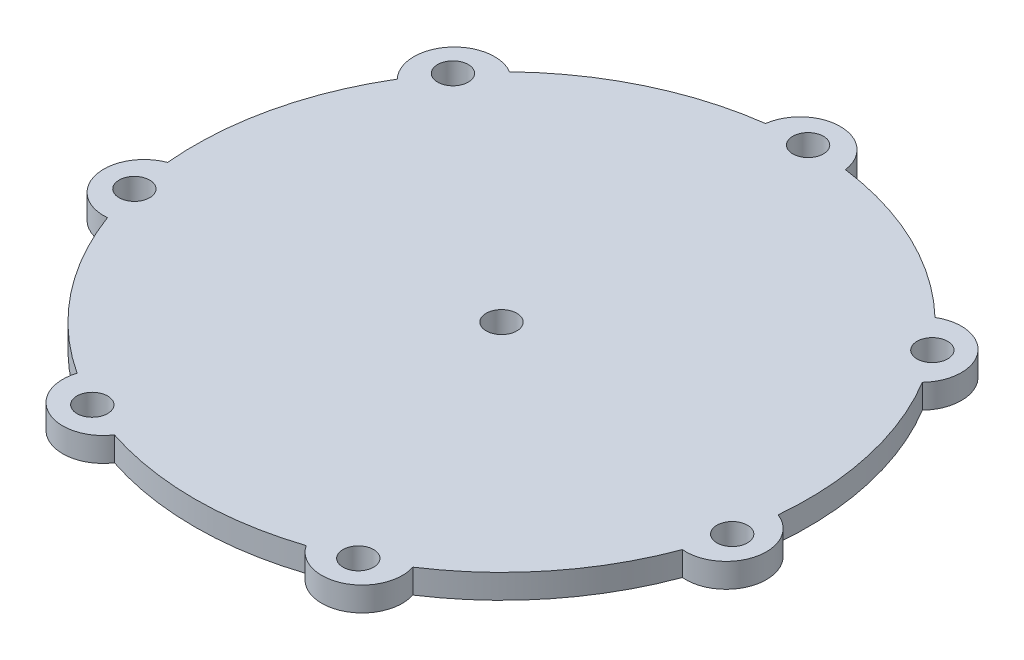
ISO-10303-21;
HEADER;
FILE_DESCRIPTION(('STEP AP214'),'2;1');
FILE_NAME('part.step','',(''),(''),'','','');
FILE_SCHEMA(('AUTOMOTIVE_DESIGN { 1 0 10303 214 1 1 1 1 }'));
ENDSEC;
DATA;
#1=APPLICATION_CONTEXT('core data for automotive mechanical design processes');
#2=APPLICATION_PROTOCOL_DEFINITION('international standard','automotive_design',2000,#1);
#3=PRODUCT_CONTEXT('',#1,'mechanical');
#4=PRODUCT('Part','Part','',(#3));
#5=PRODUCT_RELATED_PRODUCT_CATEGORY('part','',(#4));
#6=PRODUCT_DEFINITION_FORMATION('','',#4);
#7=PRODUCT_DEFINITION_CONTEXT('part definition',#1,'design');
#8=PRODUCT_DEFINITION('design','',#6,#7);
#9=PRODUCT_DEFINITION_SHAPE('','',#8);
#10=(LENGTH_UNIT() NAMED_UNIT(*) SI_UNIT(.MILLI.,.METRE.));
#11=(NAMED_UNIT(*) PLANE_ANGLE_UNIT() SI_UNIT($,.RADIAN.));
#12=(NAMED_UNIT(*) SI_UNIT($,.STERADIAN.) SOLID_ANGLE_UNIT());
#13=UNCERTAINTY_MEASURE_WITH_UNIT(LENGTH_MEASURE(1.E-05),#10,'distance_accuracy_value','');
#14=(GEOMETRIC_REPRESENTATION_CONTEXT(3) GLOBAL_UNCERTAINTY_ASSIGNED_CONTEXT((#13)) GLOBAL_UNIT_ASSIGNED_CONTEXT((#10,
#11,#12)) REPRESENTATION_CONTEXT('',''));
#15=CARTESIAN_POINT('',(0.,0.,0.));
#16=DIRECTION('',(0.,0.,1.));
#17=DIRECTION('',(1.,0.,0.));
#18=AXIS2_PLACEMENT_3D('',#15,#16,#17);
#19=CARTESIAN_POINT('',(0.,7.,0.));
#20=DIRECTION('',(0.,-1.,0.));
#21=DIRECTION('',(0.,0.,-1.));
#22=AXIS2_PLACEMENT_3D('',#19,#20,#21);
#23=CYLINDRICAL_SURFACE('',#22,38.);
#24=CARTESIAN_POINT('',(0.,3.,0.));
#25=DIRECTION('',(0.,1.,0.));
#26=DIRECTION('',(0.,0.,1.));
#27=AXIS2_PLACEMENT_3D('',#24,#25,#26);
#28=CIRCLE('',#27,38.);
#29=CARTESIAN_POINT('',(-4.95413588643874,3.,-37.6756756756757));
#30=VERTEX_POINT('',#29);
#31=CARTESIAN_POINT('',(-26.3671761642809,3.,-27.3636989663637));
#32=VERTEX_POINT('',#31);
#33=EDGE_CURVE('E1106',#30,#32,#28,.T.);
#34=ORIENTED_EDGE('',*,*,#33,.F.);
#35=DIRECTION('',(0.,-1.,0.));
#36=VECTOR('',#35,1.);
#37=CARTESIAN_POINT('',(-4.95413588643874,41.8108108108108,-37.6756756756757));
#38=LINE('',#37,#36);
#39=CARTESIAN_POINT('',(-4.95413588643874,0.,-37.6756756756757));
#40=VERTEX_POINT('',#39);
#41=EDGE_CURVE('E1012',#30,#40,#38,.T.);
#42=ORIENTED_EDGE('',*,*,#41,.T.);
#43=CARTESIAN_POINT('',(0.,0.,0.));
#44=DIRECTION('',(0.,1.,0.));
#45=DIRECTION('',(0.,0.,1.));
#46=AXIS2_PLACEMENT_3D('',#43,#44,#45);
#47=CIRCLE('',#46,38.);
#48=CARTESIAN_POINT('',(-26.3671761642809,0.,-27.3636989663637));
#49=VERTEX_POINT('',#48);
#50=EDGE_CURVE('E13',#40,#49,#47,.T.);
#51=ORIENTED_EDGE('',*,*,#50,.T.);
#52=DIRECTION('',(0.,-1.,0.));
#53=VECTOR('',#52,1.);
#54=CARTESIAN_POINT('',(-26.3671761642809,42.3401581040992,-27.3636989663637));
#55=LINE('',#54,#53);
#56=EDGE_CURVE('E1123',#32,#49,#55,.T.);
#57=ORIENTED_EDGE('',*,*,#56,.F.);
#58=EDGE_LOOP('',(#34,#42,#51,#57));
#59=FACE_BOUND('',#58,.T.);
#60=ADVANCED_FACE('F997',(#59),#23,.T.);
#61=CARTESIAN_POINT('',(0.,3.,0.));
#62=DIRECTION('',(0.,1.,0.));
#63=DIRECTION('',(0.,0.,1.));
#64=AXIS2_PLACEMENT_3D('',#61,#62,#63);
#65=CIRCLE('',#64,38.);
#66=CARTESIAN_POINT('',(-32.5448825687149,3.,-19.6171001574789));
#67=VERTEX_POINT('',#66);
#68=CARTESIAN_POINT('',(-37.8334667709229,3.,3.55370118235541));
#69=VERTEX_POINT('',#68);
#70=EDGE_CURVE('E1104',#67,#69,#65,.T.);
#71=ORIENTED_EDGE('',*,*,#70,.F.);
#72=DIRECTION('',(0.,-1.,0.));
#73=VECTOR('',#72,1.);
#74=CARTESIAN_POINT('',(-32.5448825687149,42.3401581040992,-19.6171001574789));
#75=LINE('',#74,#73);
#76=CARTESIAN_POINT('',(-32.5448825687149,0.,-19.6171001574789));
#77=VERTEX_POINT('',#76);
#78=EDGE_CURVE('E1115',#67,#77,#75,.T.);
#79=ORIENTED_EDGE('',*,*,#78,.T.);
#80=CARTESIAN_POINT('',(-37.8334667709229,0.,3.55370118235541));
#81=VERTEX_POINT('',#80);
#82=EDGE_CURVE('E1005',#77,#81,#47,.T.);
#83=ORIENTED_EDGE('',*,*,#82,.T.);
#84=DIRECTION('',(0.,-1.,0.));
#85=VECTOR('',#84,1.);
#86=CARTESIAN_POINT('',(-37.8334667709229,42.1052968000622,3.55370118235541));
#87=LINE('',#86,#85);
#88=EDGE_CURVE('E1117',#69,#81,#87,.T.);
#89=ORIENTED_EDGE('',*,*,#88,.F.);
#90=EDGE_LOOP('',(#71,#79,#83,#89));
#91=FACE_BOUND('',#90,.T.);
#92=ADVANCED_FACE('F1113',(#91),#23,.T.);
#93=CARTESIAN_POINT('',(0.,3.,0.));
#94=DIRECTION('',(0.,1.,0.));
#95=DIRECTION('',(0.,0.,1.));
#96=AXIS2_PLACEMENT_3D('',#93,#94,#95);
#97=CIRCLE('',#96,38.);
#98=CARTESIAN_POINT('',(-35.6286688821293,3.,13.213551895217));
#99=VERTEX_POINT('',#98);
#100=CARTESIAN_POINT('',(-20.8103852369823,3.,31.7950918584675));
#101=VERTEX_POINT('',#100);
#102=EDGE_CURVE('E1237',#99,#101,#97,.T.);
#103=ORIENTED_EDGE('',*,*,#102,.F.);
#104=DIRECTION('',(0.,-1.,0.));
#105=VECTOR('',#104,1.);
#106=CARTESIAN_POINT('',(-35.6286688821293,42.1052968000622,13.213551895217));
#107=LINE('',#106,#105);
#108=CARTESIAN_POINT('',(-35.6286688821293,0.,13.213551895217));
#109=VERTEX_POINT('',#108);
#110=EDGE_CURVE('E1138',#99,#109,#107,.T.);
#111=ORIENTED_EDGE('',*,*,#110,.T.);
#112=CARTESIAN_POINT('',(-20.8103852369823,0.,31.7950918584675));
#113=VERTEX_POINT('',#112);
#114=EDGE_CURVE('E1217',#109,#113,#47,.T.);
#115=ORIENTED_EDGE('',*,*,#114,.T.);
#116=DIRECTION('',(0.,-1.,0.));
#117=VECTOR('',#116,1.);
#118=CARTESIAN_POINT('',(-20.8103852369823,42.2639668536134,31.7950918584675));
#119=LINE('',#118,#117);
#120=EDGE_CURVE('E1134',#101,#113,#119,.T.);
#121=ORIENTED_EDGE('',*,*,#120,.F.);
#122=EDGE_LOOP('',(#103,#111,#115,#121));
#123=FACE_BOUND('',#122,.T.);
#124=ADVANCED_FACE('F1301',(#123),#23,.T.);
#125=CARTESIAN_POINT('',(0.,3.,0.));
#126=DIRECTION('',(0.,1.,0.));
#127=DIRECTION('',(0.,0.,1.));
#128=AXIS2_PLACEMENT_3D('',#125,#126,#127);
#129=CIRCLE('',#128,38.);
#130=CARTESIAN_POINT('',(-11.8833408349034,3.,36.0941298634767));
#131=VERTEX_POINT('',#130);
#132=CARTESIAN_POINT('',(11.8833408349029,3.,36.0941298634768));
#133=VERTEX_POINT('',#132);
#134=EDGE_CURVE('E1248',#131,#133,#129,.T.);
#135=ORIENTED_EDGE('',*,*,#134,.F.);
#136=DIRECTION('',(0.,-1.,0.));
#137=VECTOR('',#136,1.);
#138=CARTESIAN_POINT('',(-11.8833408349034,42.2639668536134,36.0941298634767));
#139=LINE('',#138,#137);
#140=CARTESIAN_POINT('',(-11.8833408349034,0.,36.0941298634767));
#141=VERTEX_POINT('',#140);
#142=EDGE_CURVE('E1148',#131,#141,#139,.T.);
#143=ORIENTED_EDGE('',*,*,#142,.T.);
#144=CARTESIAN_POINT('',(11.8833408349029,0.,36.0941298634768));
#145=VERTEX_POINT('',#144);
#146=EDGE_CURVE('E1212',#141,#145,#47,.T.);
#147=ORIENTED_EDGE('',*,*,#146,.T.);
#148=DIRECTION('',(0.,-1.,0.));
#149=VECTOR('',#148,1.);
#150=CARTESIAN_POINT('',(11.8833408349029,42.2639668536134,36.0941298634768));
#151=LINE('',#150,#149);
#152=EDGE_CURVE('E1144',#133,#145,#151,.T.);
#153=ORIENTED_EDGE('',*,*,#152,.F.);
#154=EDGE_LOOP('',(#135,#143,#147,#153));
#155=FACE_BOUND('',#154,.T.);
#156=ADVANCED_FACE('F1314',(#155),#23,.T.);
#157=CARTESIAN_POINT('',(0.,3.,0.));
#158=DIRECTION('',(0.,1.,0.));
#159=DIRECTION('',(0.,0.,1.));
#160=AXIS2_PLACEMENT_3D('',#157,#158,#159);
#161=CIRCLE('',#160,38.);
#162=CARTESIAN_POINT('',(20.8103852369819,3.,31.7950918584678));
#163=VERTEX_POINT('',#162);
#164=CARTESIAN_POINT('',(35.6286688821291,3.,13.2135518952175));
#165=VERTEX_POINT('',#164);
#166=EDGE_CURVE('E1243',#163,#165,#161,.T.);
#167=ORIENTED_EDGE('',*,*,#166,.F.);
#168=DIRECTION('',(0.,-1.,0.));
#169=VECTOR('',#168,1.);
#170=CARTESIAN_POINT('',(20.8103852369819,42.2639668536134,31.7950918584678));
#171=LINE('',#170,#169);
#172=CARTESIAN_POINT('',(20.8103852369819,0.,31.7950918584678));
#173=VERTEX_POINT('',#172);
#174=EDGE_CURVE('E1158',#163,#173,#171,.T.);
#175=ORIENTED_EDGE('',*,*,#174,.T.);
#176=CARTESIAN_POINT('',(35.6286688821291,0.,13.2135518952175));
#177=VERTEX_POINT('',#176);
#178=EDGE_CURVE('E1207',#173,#177,#47,.T.);
#179=ORIENTED_EDGE('',*,*,#178,.T.);
#180=DIRECTION('',(0.,-1.,0.));
#181=VECTOR('',#180,1.);
#182=CARTESIAN_POINT('',(35.6286688821291,42.1052968000622,13.2135518952175));
#183=LINE('',#182,#181);
#184=EDGE_CURVE('E1154',#165,#177,#183,.T.);
#185=ORIENTED_EDGE('',*,*,#184,.F.);
#186=EDGE_LOOP('',(#167,#175,#179,#185));
#187=FACE_BOUND('',#186,.T.);
#188=ADVANCED_FACE('F1310',(#187),#23,.T.);
#189=CARTESIAN_POINT('',(0.,3.,0.));
#190=DIRECTION('',(0.,1.,0.));
#191=DIRECTION('',(0.,0.,1.));
#192=AXIS2_PLACEMENT_3D('',#189,#190,#191);
#193=CIRCLE('',#192,38.);
#194=CARTESIAN_POINT('',(37.8334667709228,3.,3.55370118235592));
#195=VERTEX_POINT('',#194);
#196=CARTESIAN_POINT('',(32.5448825687152,3.,-19.6171001574784));
#197=VERTEX_POINT('',#196);
#198=EDGE_CURVE('E1232',#195,#197,#193,.T.);
#199=ORIENTED_EDGE('',*,*,#198,.F.);
#200=DIRECTION('',(0.,-1.,0.));
#201=VECTOR('',#200,1.);
#202=CARTESIAN_POINT('',(37.8334667709228,42.1052968000622,3.55370118235592));
#203=LINE('',#202,#201);
#204=CARTESIAN_POINT('',(37.8334667709228,0.,3.55370118235592));
#205=VERTEX_POINT('',#204);
#206=EDGE_CURVE('E1168',#195,#205,#203,.T.);
#207=ORIENTED_EDGE('',*,*,#206,.T.);
#208=CARTESIAN_POINT('',(32.5448825687152,0.,-19.6171001574784));
#209=VERTEX_POINT('',#208);
#210=EDGE_CURVE('E1205',#205,#209,#47,.T.);
#211=ORIENTED_EDGE('',*,*,#210,.T.);
#212=DIRECTION('',(0.,-1.,0.));
#213=VECTOR('',#212,1.);
#214=CARTESIAN_POINT('',(32.5448825687152,42.3401581040992,-19.6171001574784));
#215=LINE('',#214,#213);
#216=EDGE_CURVE('E1164',#197,#209,#215,.T.);
#217=ORIENTED_EDGE('',*,*,#216,.F.);
#218=EDGE_LOOP('',(#199,#207,#211,#217));
#219=FACE_BOUND('',#218,.T.);
#220=ADVANCED_FACE('F1303',(#219),#23,.T.);
#221=CARTESIAN_POINT('',(0.,3.,0.));
#222=DIRECTION('',(0.,1.,0.));
#223=DIRECTION('',(0.,0.,1.));
#224=AXIS2_PLACEMENT_3D('',#221,#222,#223);
#225=CIRCLE('',#224,38.);
#226=CARTESIAN_POINT('',(26.3671761642813,3.,-27.3636989663634));
#227=VERTEX_POINT('',#226);
#228=CARTESIAN_POINT('',(4.95413588643874,3.,-37.6756756756757));
#229=VERTEX_POINT('',#228);
#230=EDGE_CURVE('E1194',#227,#229,#225,.T.);
#231=ORIENTED_EDGE('',*,*,#230,.F.);
#232=DIRECTION('',(0.,-1.,0.));
#233=VECTOR('',#232,1.);
#234=CARTESIAN_POINT('',(26.3671761642813,42.3401581040992,-27.3636989663634));
#235=LINE('',#234,#233);
#236=CARTESIAN_POINT('',(26.3671761642813,0.,-27.3636989663634));
#237=VERTEX_POINT('',#236);
#238=EDGE_CURVE('E1177',#227,#237,#235,.T.);
#239=ORIENTED_EDGE('',*,*,#238,.T.);
#240=CARTESIAN_POINT('',(4.95413588643874,0.,-37.6756756756757));
#241=VERTEX_POINT('',#240);
#242=EDGE_CURVE('E1006',#237,#241,#47,.T.);
#243=ORIENTED_EDGE('',*,*,#242,.T.);
#244=DIRECTION('',(0.,-1.,0.));
#245=VECTOR('',#244,1.);
#246=CARTESIAN_POINT('',(4.95413588643874,41.8108108108108,-37.6756756756757));
#247=LINE('',#246,#245);
#248=EDGE_CURVE('E1019',#229,#241,#247,.T.);
#249=ORIENTED_EDGE('',*,*,#248,.F.);
#250=EDGE_LOOP('',(#231,#239,#243,#249));
#251=FACE_BOUND('',#250,.T.);
#252=ADVANCED_FACE('F1203',(#251),#23,.T.);
#253=CARTESIAN_POINT('',(0.,41.8108108108108,-37.));
#254=DIRECTION('',(0.,-1.,0.));
#255=DIRECTION('',(0.,0.,-1.));
#256=AXIS2_PLACEMENT_3D('',#253,#254,#255);
#257=CYLINDRICAL_SURFACE('',#256,5.);
#258=CARTESIAN_POINT('',(0.,3.,-37.));
#259=DIRECTION('',(0.,1.,0.));
#260=DIRECTION('',(0.,0.,1.));
#261=AXIS2_PLACEMENT_3D('',#258,#259,#260);
#262=CIRCLE('',#261,5.);
#263=EDGE_CURVE('E1192',#30,#229,#262,.F.);
#264=ORIENTED_EDGE('',*,*,#263,.T.);
#265=ORIENTED_EDGE('',*,*,#248,.T.);
#266=CARTESIAN_POINT('',(0.,0.,-37.));
#267=DIRECTION('',(0.,1.,0.));
#268=DIRECTION('',(0.,0.,1.));
#269=AXIS2_PLACEMENT_3D('',#266,#267,#268);
#270=CIRCLE('',#269,5.);
#271=EDGE_CURVE('E1183',#40,#241,#270,.F.);
#272=ORIENTED_EDGE('',*,*,#271,.F.);
#273=ORIENTED_EDGE('',*,*,#41,.F.);
#274=EDGE_LOOP('',(#264,#265,#272,#273));
#275=FACE_BOUND('',#274,.T.);
#276=ADVANCED_FACE('F1191',(#275),#257,.T.);
#277=CARTESIAN_POINT('',(0.,41.8108108108108,-38.));
#278=DIRECTION('',(0.,-1.,0.));
#279=DIRECTION('',(0.,0.,-1.));
#280=AXIS2_PLACEMENT_3D('',#277,#278,#279);
#281=CYLINDRICAL_SURFACE('',#280,1.9);
#282=CARTESIAN_POINT('',(0.,0.,-38.));
#283=DIRECTION('',(0.,1.,0.));
#284=DIRECTION('',(0.,0.,1.));
#285=AXIS2_PLACEMENT_3D('',#282,#283,#284);
#286=CIRCLE('',#285,1.9);
#287=CARTESIAN_POINT('',(0.,0.,-36.1));
#288=VERTEX_POINT('',#287);
#289=EDGE_CURVE('E1180',#288,#288,#286,.T.);
#290=ORIENTED_EDGE('',*,*,#289,.F.);
#291=EDGE_LOOP('',(#290));
#292=FACE_BOUND('',#291,.T.);
#293=CARTESIAN_POINT('',(0.,3.,-38.));
#294=DIRECTION('',(0.,1.,0.));
#295=DIRECTION('',(0.,0.,1.));
#296=AXIS2_PLACEMENT_3D('',#293,#294,#295);
#297=CIRCLE('',#296,1.9);
#298=CARTESIAN_POINT('',(0.,3.,-36.1));
#299=VERTEX_POINT('',#298);
#300=EDGE_CURVE('E1265',#299,#299,#297,.T.);
#301=ORIENTED_EDGE('',*,*,#300,.T.);
#302=EDGE_LOOP('',(#301));
#303=FACE_BOUND('',#302,.T.);
#304=ADVANCED_FACE('F1308',(#292,#303),#281,.F.);
#305=CARTESIAN_POINT('',(28.9277648513172,42.3401581040992,-23.0691226687731));
#306=DIRECTION('',(0.,-1.,0.));
#307=DIRECTION('',(0.,0.,-1.));
#308=AXIS2_PLACEMENT_3D('',#305,#306,#307);
#309=CYLINDRICAL_SURFACE('',#308,5.);
#310=CARTESIAN_POINT('',(28.9277648513172,3.,-23.0691226687731));
#311=DIRECTION('',(0.,1.,0.));
#312=DIRECTION('',(0.,0.,1.));
#313=AXIS2_PLACEMENT_3D('',#310,#311,#312);
#314=CIRCLE('',#313,5.);
#315=EDGE_CURVE('E1198',#227,#197,#314,.F.);
#316=ORIENTED_EDGE('',*,*,#315,.T.);
#317=ORIENTED_EDGE('',*,*,#216,.T.);
#318=CARTESIAN_POINT('',(28.9277648513172,0.,-23.0691226687731));
#319=DIRECTION('',(0.,1.,0.));
#320=DIRECTION('',(-0.781831482468031,0.,0.623489801858732));
#321=AXIS2_PLACEMENT_3D('',#318,#319,#320);
#322=CIRCLE('',#321,5.);
#323=EDGE_CURVE('E1174',#237,#209,#322,.F.);
#324=ORIENTED_EDGE('',*,*,#323,.F.);
#325=ORIENTED_EDGE('',*,*,#238,.F.);
#326=EDGE_LOOP('',(#316,#317,#324,#325));
#327=FACE_BOUND('',#326,.T.);
#328=ADVANCED_FACE('F1321',(#327),#309,.T.);
#329=CARTESIAN_POINT('',(29.7095963337852,42.3401581040992,-23.6926124706318));
#330=DIRECTION('',(0.,-1.,0.));
#331=DIRECTION('',(0.,0.,-1.));
#332=AXIS2_PLACEMENT_3D('',#329,#330,#331);
#333=CYLINDRICAL_SURFACE('',#332,1.9);
#334=CARTESIAN_POINT('',(29.7095963337852,0.,-23.6926124706318));
#335=DIRECTION('',(0.,1.,0.));
#336=DIRECTION('',(-0.781831482468031,0.,0.623489801858732));
#337=AXIS2_PLACEMENT_3D('',#334,#335,#336);
#338=CIRCLE('',#337,1.9);
#339=CARTESIAN_POINT('',(28.2241165170959,0.,-22.5079818471002));
#340=VERTEX_POINT('',#339);
#341=EDGE_CURVE('E1171',#340,#340,#338,.T.);
#342=ORIENTED_EDGE('',*,*,#341,.F.);
#343=EDGE_LOOP('',(#342));
#344=FACE_BOUND('',#343,.T.);
#345=CARTESIAN_POINT('',(29.7095963337852,3.,-23.6926124706318));
#346=DIRECTION('',(0.,1.,0.));
#347=DIRECTION('',(0.,0.,1.));
#348=AXIS2_PLACEMENT_3D('',#345,#346,#347);
#349=CIRCLE('',#348,1.9);
#350=CARTESIAN_POINT('',(29.7095963337852,3.,-21.7926124706318));
#351=VERTEX_POINT('',#350);
#352=EDGE_CURVE('E1262',#351,#351,#349,.T.);
#353=ORIENTED_EDGE('',*,*,#352,.T.);
#354=EDGE_LOOP('',(#353));
#355=FACE_BOUND('',#354,.T.);
#356=ADVANCED_FACE('F1323',(#344,#355),#333,.F.);
#357=CARTESIAN_POINT('',(36.0723327507274,42.1052968000622,8.23327455638378));
#358=DIRECTION('',(0.,-1.,0.));
#359=DIRECTION('',(0.,0.,-1.));
#360=AXIS2_PLACEMENT_3D('',#357,#358,#359);
#361=CYLINDRICAL_SURFACE('',#360,5.);
#362=CARTESIAN_POINT('',(36.0723327507274,3.,8.23327455638378));
#363=DIRECTION('',(0.,1.,0.));
#364=DIRECTION('',(0.,0.,1.));
#365=AXIS2_PLACEMENT_3D('',#362,#363,#364);
#366=CIRCLE('',#365,5.);
#367=EDGE_CURVE('E1239',#195,#165,#366,.F.);
#368=ORIENTED_EDGE('',*,*,#367,.T.);
#369=ORIENTED_EDGE('',*,*,#184,.T.);
#370=CARTESIAN_POINT('',(36.0723327507274,0.,8.23327455638378));
#371=DIRECTION('',(0.,1.,0.));
#372=DIRECTION('',(-0.974927912181823,0.,-0.222520933956318));
#373=AXIS2_PLACEMENT_3D('',#370,#371,#372);
#374=CIRCLE('',#373,5.);
#375=EDGE_CURVE('E1165',#205,#177,#374,.F.);
#376=ORIENTED_EDGE('',*,*,#375,.F.);
#377=ORIENTED_EDGE('',*,*,#206,.F.);
#378=EDGE_LOOP('',(#368,#369,#376,#377));
#379=FACE_BOUND('',#378,.T.);
#380=ADVANCED_FACE('F1319',(#379),#361,.T.);
#381=CARTESIAN_POINT('',(37.0472606629093,42.1052968000622,8.45579549034009));
#382=DIRECTION('',(0.,-1.,0.));
#383=DIRECTION('',(0.,0.,-1.));
#384=AXIS2_PLACEMENT_3D('',#381,#382,#383);
#385=CYLINDRICAL_SURFACE('',#384,1.9);
#386=CARTESIAN_POINT('',(37.0472606629093,0.,8.45579549034009));
#387=DIRECTION('',(0.,1.,0.));
#388=DIRECTION('',(-0.974927912181823,0.,-0.222520933956318));
#389=AXIS2_PLACEMENT_3D('',#386,#387,#388);
#390=CIRCLE('',#389,1.9);
#391=CARTESIAN_POINT('',(35.1948976297638,0.,8.03300571582309));
#392=VERTEX_POINT('',#391);
#393=EDGE_CURVE('E1161',#392,#392,#390,.T.);
#394=ORIENTED_EDGE('',*,*,#393,.F.);
#395=EDGE_LOOP('',(#394));
#396=FACE_BOUND('',#395,.T.);
#397=CARTESIAN_POINT('',(37.0472606629093,3.,8.45579549034009));
#398=DIRECTION('',(0.,1.,0.));
#399=DIRECTION('',(0.,0.,1.));
#400=AXIS2_PLACEMENT_3D('',#397,#398,#399);
#401=CIRCLE('',#400,1.9);
#402=CARTESIAN_POINT('',(37.0472606629093,3.,10.3557954903401));
#403=VERTEX_POINT('',#402);
#404=EDGE_CURVE('E1259',#403,#403,#401,.T.);
#405=ORIENTED_EDGE('',*,*,#404,.T.);
#406=EDGE_LOOP('',(#405));
#407=FACE_BOUND('',#406,.T.);
#408=ADVANCED_FACE('F1336',(#396,#407),#385,.F.);
#409=CARTESIAN_POINT('',(16.0536983473495,42.2639668536134,33.3358481123896));
#410=DIRECTION('',(0.,-1.,0.));
#411=DIRECTION('',(0.,0.,-1.));
#412=AXIS2_PLACEMENT_3D('',#409,#410,#411);
#413=CYLINDRICAL_SURFACE('',#412,5.);
#414=CARTESIAN_POINT('',(16.0536983473495,3.,33.3358481123896));
#415=DIRECTION('',(0.,1.,0.));
#416=DIRECTION('',(0.,0.,1.));
#417=AXIS2_PLACEMENT_3D('',#414,#415,#416);
#418=CIRCLE('',#417,5.);
#419=EDGE_CURVE('E1242',#163,#133,#418,.F.);
#420=ORIENTED_EDGE('',*,*,#419,.T.);
#421=ORIENTED_EDGE('',*,*,#152,.T.);
#422=CARTESIAN_POINT('',(16.0536983473495,0.,33.3358481123896));
#423=DIRECTION('',(0.,1.,0.));
#424=DIRECTION('',(-0.433883739117553,0.,-0.900968867902422));
#425=AXIS2_PLACEMENT_3D('',#422,#423,#424);
#426=CIRCLE('',#425,5.);
#427=EDGE_CURVE('E1155',#173,#145,#426,.F.);
#428=ORIENTED_EDGE('',*,*,#427,.F.);
#429=ORIENTED_EDGE('',*,*,#174,.F.);
#430=EDGE_LOOP('',(#420,#421,#428,#429));
#431=FACE_BOUND('',#430,.T.);
#432=ADVANCED_FACE('F1339',(#431),#413,.T.);
#433=CARTESIAN_POINT('',(16.487582086467,42.2639668536134,34.236816980292));
#434=DIRECTION('',(0.,-1.,0.));
#435=DIRECTION('',(0.,0.,-1.));
#436=AXIS2_PLACEMENT_3D('',#433,#434,#435);
#437=CYLINDRICAL_SURFACE('',#436,1.9);
#438=CARTESIAN_POINT('',(16.487582086467,0.,34.236816980292));
#439=DIRECTION('',(0.,1.,0.));
#440=DIRECTION('',(-0.433883739117553,0.,-0.900968867902422));
#441=AXIS2_PLACEMENT_3D('',#438,#439,#440);
#442=CIRCLE('',#441,1.9);
#443=CARTESIAN_POINT('',(15.6632029821437,0.,32.5249761312774));
#444=VERTEX_POINT('',#443);
#445=EDGE_CURVE('E1151',#444,#444,#442,.T.);
#446=ORIENTED_EDGE('',*,*,#445,.F.);
#447=EDGE_LOOP('',(#446));
#448=FACE_BOUND('',#447,.T.);
#449=CARTESIAN_POINT('',(16.487582086467,3.,34.236816980292));
#450=DIRECTION('',(0.,1.,0.));
#451=DIRECTION('',(0.,0.,1.));
#452=AXIS2_PLACEMENT_3D('',#449,#450,#451);
#453=CIRCLE('',#452,1.9);
#454=CARTESIAN_POINT('',(16.487582086467,3.,36.136816980292));
#455=VERTEX_POINT('',#454);
#456=EDGE_CURVE('E1256',#455,#455,#453,.T.);
#457=ORIENTED_EDGE('',*,*,#456,.T.);
#458=EDGE_LOOP('',(#457));
#459=FACE_BOUND('',#458,.T.);
#460=ADVANCED_FACE('F1343',(#448,#459),#437,.F.);
#461=CARTESIAN_POINT('',(-16.0536983473499,42.2639668536134,33.3358481123894));
#462=DIRECTION('',(0.,-1.,0.));
#463=DIRECTION('',(0.,0.,-1.));
#464=AXIS2_PLACEMENT_3D('',#461,#462,#463);
#465=CYLINDRICAL_SURFACE('',#464,5.);
#466=CARTESIAN_POINT('',(-16.0536983473499,3.,33.3358481123894));
#467=DIRECTION('',(0.,1.,0.));
#468=DIRECTION('',(0.,0.,1.));
#469=AXIS2_PLACEMENT_3D('',#466,#467,#468);
#470=CIRCLE('',#469,5.);
#471=EDGE_CURVE('E1240',#131,#101,#470,.F.);
#472=ORIENTED_EDGE('',*,*,#471,.T.);
#473=ORIENTED_EDGE('',*,*,#120,.T.);
#474=CARTESIAN_POINT('',(-16.0536983473499,0.,33.3358481123894));
#475=DIRECTION('',(0.,1.,0.));
#476=DIRECTION('',(0.433883739117565,0.,-0.900968867902416));
#477=AXIS2_PLACEMENT_3D('',#474,#475,#476);
#478=CIRCLE('',#477,5.);
#479=EDGE_CURVE('E1145',#141,#113,#478,.F.);
#480=ORIENTED_EDGE('',*,*,#479,.F.);
#481=ORIENTED_EDGE('',*,*,#142,.F.);
#482=EDGE_LOOP('',(#472,#473,#480,#481));
#483=FACE_BOUND('',#482,.T.);
#484=ADVANCED_FACE('F1347',(#483),#465,.T.);
#485=CARTESIAN_POINT('',(-16.4875820864675,42.2639668536134,34.2368169802918));
#486=DIRECTION('',(0.,-1.,0.));
#487=DIRECTION('',(0.,0.,-1.));
#488=AXIS2_PLACEMENT_3D('',#485,#486,#487);
#489=CYLINDRICAL_SURFACE('',#488,1.9);
#490=CARTESIAN_POINT('',(-16.4875820864675,0.,34.2368169802918));
#491=DIRECTION('',(0.,1.,0.));
#492=DIRECTION('',(0.433883739117565,0.,-0.900968867902416));
#493=AXIS2_PLACEMENT_3D('',#490,#491,#492);
#494=CIRCLE('',#493,1.9);
#495=CARTESIAN_POINT('',(-15.6632029821441,0.,32.5249761312772));
#496=VERTEX_POINT('',#495);
#497=EDGE_CURVE('E1141',#496,#496,#494,.T.);
#498=ORIENTED_EDGE('',*,*,#497,.F.);
#499=EDGE_LOOP('',(#498));
#500=FACE_BOUND('',#499,.T.);
#501=CARTESIAN_POINT('',(-16.4875820864675,3.,34.2368169802918));
#502=DIRECTION('',(0.,1.,0.));
#503=DIRECTION('',(0.,0.,1.));
#504=AXIS2_PLACEMENT_3D('',#501,#502,#503);
#505=CIRCLE('',#504,1.9);
#506=CARTESIAN_POINT('',(-16.4875820864675,3.,36.1368169802918));
#507=VERTEX_POINT('',#506);
#508=EDGE_CURVE('E1253',#507,#507,#505,.T.);
#509=ORIENTED_EDGE('',*,*,#508,.T.);
#510=EDGE_LOOP('',(#509));
#511=FACE_BOUND('',#510,.T.);
#512=ADVANCED_FACE('F1351',(#500,#511),#489,.F.);
#513=CARTESIAN_POINT('',(-36.0723327507276,42.1052968000622,8.23327455638329));
#514=DIRECTION('',(0.,-1.,0.));
#515=DIRECTION('',(0.,0.,-1.));
#516=AXIS2_PLACEMENT_3D('',#513,#514,#515);
#517=CYLINDRICAL_SURFACE('',#516,5.);
#518=CARTESIAN_POINT('',(-36.0723327507276,3.,8.23327455638329));
#519=DIRECTION('',(0.,1.,0.));
#520=DIRECTION('',(0.,0.,1.));
#521=AXIS2_PLACEMENT_3D('',#518,#519,#520);
#522=CIRCLE('',#521,5.);
#523=EDGE_CURVE('E1201',#99,#69,#522,.F.);
#524=ORIENTED_EDGE('',*,*,#523,.T.);
#525=ORIENTED_EDGE('',*,*,#88,.T.);
#526=CARTESIAN_POINT('',(-36.0723327507276,0.,8.23327455638329));
#527=DIRECTION('',(0.,1.,0.));
#528=DIRECTION('',(0.974927912181826,0.,-0.222520933956305));
#529=AXIS2_PLACEMENT_3D('',#526,#527,#528);
#530=CIRCLE('',#529,5.);
#531=EDGE_CURVE('E1135',#109,#81,#530,.F.);
#532=ORIENTED_EDGE('',*,*,#531,.F.);
#533=ORIENTED_EDGE('',*,*,#110,.F.);
#534=EDGE_LOOP('',(#524,#525,#532,#533));
#535=FACE_BOUND('',#534,.T.);
#536=ADVANCED_FACE('F1228',(#535),#517,.T.);
#537=CARTESIAN_POINT('',(-37.0472606629094,42.1052968000622,8.45579549033959));
#538=DIRECTION('',(0.,-1.,0.));
#539=DIRECTION('',(0.,0.,-1.));
#540=AXIS2_PLACEMENT_3D('',#537,#538,#539);
#541=CYLINDRICAL_SURFACE('',#540,1.9);
#542=CARTESIAN_POINT('',(-37.0472606629094,0.,8.45579549033959));
#543=DIRECTION('',(0.,1.,0.));
#544=DIRECTION('',(0.974927912181826,0.,-0.222520933956305));
#545=AXIS2_PLACEMENT_3D('',#542,#543,#544);
#546=CIRCLE('',#545,1.9);
#547=CARTESIAN_POINT('',(-35.1948976297639,0.,8.03300571582261));
#548=VERTEX_POINT('',#547);
#549=EDGE_CURVE('E1131',#548,#548,#546,.T.);
#550=ORIENTED_EDGE('',*,*,#549,.F.);
#551=EDGE_LOOP('',(#550));
#552=FACE_BOUND('',#551,.T.);
#553=CARTESIAN_POINT('',(-37.0472606629094,3.,8.45579549033959));
#554=DIRECTION('',(0.,1.,0.));
#555=DIRECTION('',(0.,0.,1.));
#556=AXIS2_PLACEMENT_3D('',#553,#554,#555);
#557=CIRCLE('',#556,1.9);
#558=CARTESIAN_POINT('',(-37.0472606629094,3.,10.3557954903396));
#559=VERTEX_POINT('',#558);
#560=EDGE_CURVE('E1250',#559,#559,#557,.T.);
#561=ORIENTED_EDGE('',*,*,#560,.T.);
#562=EDGE_LOOP('',(#561));
#563=FACE_BOUND('',#562,.T.);
#564=ADVANCED_FACE('F1358',(#552,#563),#541,.F.);
#565=CARTESIAN_POINT('',(-28.9277648513168,42.3401581040992,-23.0691226687735));
#566=DIRECTION('',(0.,-1.,0.));
#567=DIRECTION('',(0.,0.,-1.));
#568=AXIS2_PLACEMENT_3D('',#565,#566,#567);
#569=CYLINDRICAL_SURFACE('',#568,5.);
#570=CARTESIAN_POINT('',(-28.9277648513168,3.,-23.0691226687735));
#571=DIRECTION('',(0.,1.,0.));
#572=DIRECTION('',(0.,0.,1.));
#573=AXIS2_PLACEMENT_3D('',#570,#571,#572);
#574=CIRCLE('',#573,5.);
#575=EDGE_CURVE('E1100',#67,#32,#574,.F.);
#576=ORIENTED_EDGE('',*,*,#575,.T.);
#577=ORIENTED_EDGE('',*,*,#56,.T.);
#578=CARTESIAN_POINT('',(-28.9277648513168,0.,-23.0691226687735));
#579=DIRECTION('',(0.,1.,0.));
#580=DIRECTION('',(0.781831482468022,0.,0.623489801858743));
#581=AXIS2_PLACEMENT_3D('',#578,#579,#580);
#582=CIRCLE('',#581,5.);
#583=EDGE_CURVE('E1121',#77,#49,#582,.F.);
#584=ORIENTED_EDGE('',*,*,#583,.F.);
#585=ORIENTED_EDGE('',*,*,#78,.F.);
#586=EDGE_LOOP('',(#576,#577,#584,#585));
#587=FACE_BOUND('',#586,.T.);
#588=ADVANCED_FACE('F1119',(#587),#569,.T.);
#589=CARTESIAN_POINT('',(-29.7095963337848,42.3401581040992,-23.6926124706322));
#590=DIRECTION('',(0.,-1.,0.));
#591=DIRECTION('',(0.,0.,-1.));
#592=AXIS2_PLACEMENT_3D('',#589,#590,#591);
#593=CYLINDRICAL_SURFACE('',#592,1.9);
#594=CARTESIAN_POINT('',(-29.7095963337848,0.,-23.6926124706322));
#595=DIRECTION('',(0.,1.,0.));
#596=DIRECTION('',(0.781831482468022,0.,0.623489801858743));
#597=AXIS2_PLACEMENT_3D('',#594,#595,#596);
#598=CIRCLE('',#597,1.9);
#599=CARTESIAN_POINT('',(-28.2241165170956,0.,-22.5079818471006));
#600=VERTEX_POINT('',#599);
#601=EDGE_CURVE('E1125',#600,#600,#598,.T.);
#602=ORIENTED_EDGE('',*,*,#601,.F.);
#603=EDGE_LOOP('',(#602));
#604=FACE_BOUND('',#603,.T.);
#605=CARTESIAN_POINT('',(-29.7095963337848,3.,-23.6926124706322));
#606=DIRECTION('',(0.,1.,0.));
#607=DIRECTION('',(0.,0.,1.));
#608=AXIS2_PLACEMENT_3D('',#605,#606,#607);
#609=CIRCLE('',#608,1.9);
#610=CARTESIAN_POINT('',(-29.7095963337848,3.,-21.7926124706322));
#611=VERTEX_POINT('',#610);
#612=EDGE_CURVE('E1110',#611,#611,#609,.T.);
#613=ORIENTED_EDGE('',*,*,#612,.T.);
#614=EDGE_LOOP('',(#613));
#615=FACE_BOUND('',#614,.T.);
#616=ADVANCED_FACE('F1274',(#604,#615),#593,.F.);
#617=CARTESIAN_POINT('',(0.,19.3740115370178,0.));
#618=DIRECTION('',(0.,-1.,0.));
#619=DIRECTION('',(0.,0.,-1.));
#620=AXIS2_PLACEMENT_3D('',#617,#618,#619);
#621=CYLINDRICAL_SURFACE('',#620,1.9);
#622=CARTESIAN_POINT('',(0.,0.,0.));
#623=DIRECTION('',(0.,1.,0.));
#624=DIRECTION('',(0.,0.,1.));
#625=AXIS2_PLACEMENT_3D('',#622,#623,#624);
#626=CIRCLE('',#625,1.9);
#627=CARTESIAN_POINT('',(0.,0.,1.9));
#628=VERTEX_POINT('',#627);
#629=EDGE_CURVE('E1127',#628,#628,#626,.T.);
#630=ORIENTED_EDGE('',*,*,#629,.F.);
#631=EDGE_LOOP('',(#630));
#632=FACE_BOUND('',#631,.T.);
#633=CARTESIAN_POINT('',(0.,3.,0.));
#634=DIRECTION('',(0.,1.,0.));
#635=DIRECTION('',(0.,0.,1.));
#636=AXIS2_PLACEMENT_3D('',#633,#634,#635);
#637=CIRCLE('',#636,1.9);
#638=CARTESIAN_POINT('',(0.,3.,1.9));
#639=VERTEX_POINT('',#638);
#640=EDGE_CURVE('E1000',#639,#639,#637,.T.);
#641=ORIENTED_EDGE('',*,*,#640,.T.);
#642=EDGE_LOOP('',(#641));
#643=FACE_BOUND('',#642,.T.);
#644=ADVANCED_FACE('F1277',(#632,#643),#621,.F.);
#645=CARTESIAN_POINT('',(0.,0.,0.));
#646=DIRECTION('',(0.,1.,0.));
#647=DIRECTION('',(0.,0.,1.));
#648=AXIS2_PLACEMENT_3D('',#645,#646,#647);
#649=PLANE('',#648);
#650=ORIENTED_EDGE('',*,*,#629,.T.);
#651=EDGE_LOOP('',(#650));
#652=FACE_BOUND('',#651,.T.);
#653=ORIENTED_EDGE('',*,*,#601,.T.);
#654=EDGE_LOOP('',(#653));
#655=FACE_BOUND('',#654,.T.);
#656=ORIENTED_EDGE('',*,*,#549,.T.);
#657=EDGE_LOOP('',(#656));
#658=FACE_BOUND('',#657,.T.);
#659=ORIENTED_EDGE('',*,*,#497,.T.);
#660=EDGE_LOOP('',(#659));
#661=FACE_BOUND('',#660,.T.);
#662=ORIENTED_EDGE('',*,*,#445,.T.);
#663=EDGE_LOOP('',(#662));
#664=FACE_BOUND('',#663,.T.);
#665=ORIENTED_EDGE('',*,*,#393,.T.);
#666=EDGE_LOOP('',(#665));
#667=FACE_BOUND('',#666,.T.);
#668=ORIENTED_EDGE('',*,*,#341,.T.);
#669=EDGE_LOOP('',(#668));
#670=FACE_BOUND('',#669,.T.);
#671=ORIENTED_EDGE('',*,*,#289,.T.);
#672=EDGE_LOOP('',(#671));
#673=FACE_BOUND('',#672,.T.);
#674=ORIENTED_EDGE('',*,*,#50,.F.);
#675=ORIENTED_EDGE('',*,*,#271,.T.);
#676=ORIENTED_EDGE('',*,*,#242,.F.);
#677=ORIENTED_EDGE('',*,*,#323,.T.);
#678=ORIENTED_EDGE('',*,*,#210,.F.);
#679=ORIENTED_EDGE('',*,*,#375,.T.);
#680=ORIENTED_EDGE('',*,*,#178,.F.);
#681=ORIENTED_EDGE('',*,*,#427,.T.);
#682=ORIENTED_EDGE('',*,*,#146,.F.);
#683=ORIENTED_EDGE('',*,*,#479,.T.);
#684=ORIENTED_EDGE('',*,*,#114,.F.);
#685=ORIENTED_EDGE('',*,*,#531,.T.);
#686=ORIENTED_EDGE('',*,*,#82,.F.);
#687=ORIENTED_EDGE('',*,*,#583,.T.);
#688=EDGE_LOOP('',(#674,#675,#676,#677,#678,#679,#680,#681,#682,#683,#684,#685,#686,#687));
#689=FACE_BOUND('',#688,.T.);
#690=ADVANCED_FACE('F1190',(#652,#655,#658,#661,#664,#667,#670,#673,#689),#649,.F.);
#691=CARTESIAN_POINT('',(0.,3.,0.));
#692=DIRECTION('',(0.,1.,0.));
#693=DIRECTION('',(0.,0.,1.));
#694=AXIS2_PLACEMENT_3D('',#691,#692,#693);
#695=PLANE('',#694);
#696=ORIENTED_EDGE('',*,*,#300,.F.);
#697=EDGE_LOOP('',(#696));
#698=FACE_BOUND('',#697,.T.);
#699=ORIENTED_EDGE('',*,*,#352,.F.);
#700=EDGE_LOOP('',(#699));
#701=FACE_BOUND('',#700,.T.);
#702=ORIENTED_EDGE('',*,*,#404,.F.);
#703=EDGE_LOOP('',(#702));
#704=FACE_BOUND('',#703,.T.);
#705=ORIENTED_EDGE('',*,*,#456,.F.);
#706=EDGE_LOOP('',(#705));
#707=FACE_BOUND('',#706,.T.);
#708=ORIENTED_EDGE('',*,*,#508,.F.);
#709=EDGE_LOOP('',(#708));
#710=FACE_BOUND('',#709,.T.);
#711=ORIENTED_EDGE('',*,*,#560,.F.);
#712=EDGE_LOOP('',(#711));
#713=FACE_BOUND('',#712,.T.);
#714=ORIENTED_EDGE('',*,*,#640,.F.);
#715=EDGE_LOOP('',(#714));
#716=FACE_BOUND('',#715,.T.);
#717=ORIENTED_EDGE('',*,*,#612,.F.);
#718=EDGE_LOOP('',(#717));
#719=FACE_BOUND('',#718,.T.);
#720=ORIENTED_EDGE('',*,*,#134,.T.);
#721=ORIENTED_EDGE('',*,*,#419,.F.);
#722=ORIENTED_EDGE('',*,*,#166,.T.);
#723=ORIENTED_EDGE('',*,*,#367,.F.);
#724=ORIENTED_EDGE('',*,*,#198,.T.);
#725=ORIENTED_EDGE('',*,*,#315,.F.);
#726=ORIENTED_EDGE('',*,*,#230,.T.);
#727=ORIENTED_EDGE('',*,*,#263,.F.);
#728=ORIENTED_EDGE('',*,*,#33,.T.);
#729=ORIENTED_EDGE('',*,*,#575,.F.);
#730=ORIENTED_EDGE('',*,*,#70,.T.);
#731=ORIENTED_EDGE('',*,*,#523,.F.);
#732=ORIENTED_EDGE('',*,*,#102,.T.);
#733=ORIENTED_EDGE('',*,*,#471,.F.);
#734=EDGE_LOOP('',(#720,#721,#722,#723,#724,#725,#726,#727,#728,#729,#730,#731,#732,#733));
#735=FACE_BOUND('',#734,.T.);
#736=ADVANCED_FACE('F1103',(#698,#701,#704,#707,#710,#713,#716,#719,#735),#695,.T.);
#737=CLOSED_SHELL('',(#60,#92,#124,#156,#188,#220,#252,#276,#304,#328,#356,#380,#408,#432,#460,
#484,#512,#536,#564,#588,#616,#644,#690,#736));
#738=MANIFOLD_SOLID_BREP('B2',#737);
#739=ADVANCED_BREP_SHAPE_REPRESENTATION('',(#18,#738),#14);
#740=SHAPE_DEFINITION_REPRESENTATION(#9,#739);
ENDSEC;
END-ISO-10303-21;
